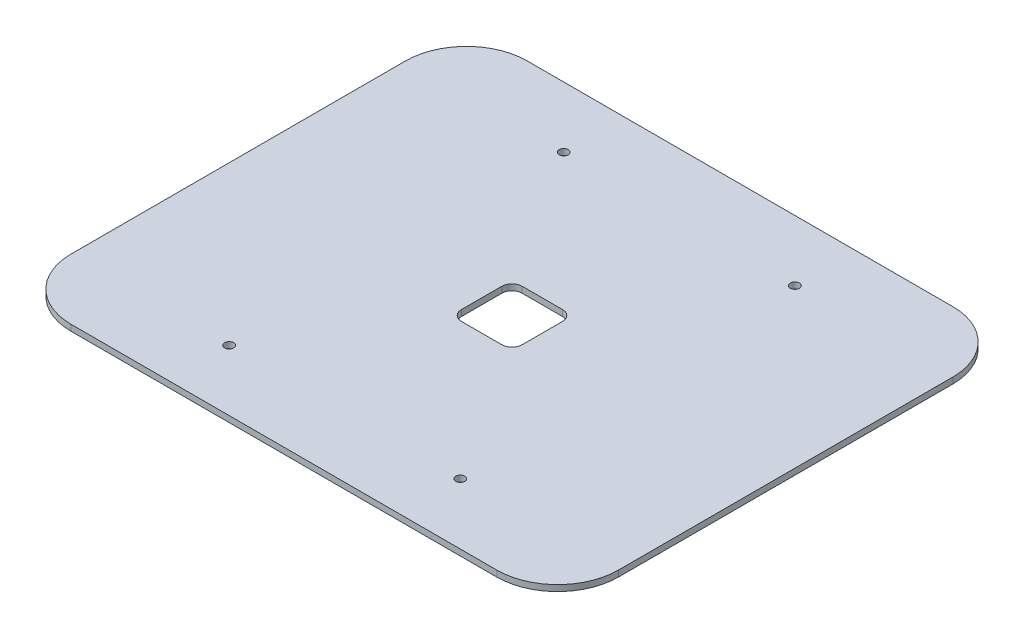
ISO-10303-21;
HEADER;
FILE_DESCRIPTION(('STEP AP214'),'2;1');
FILE_NAME('part.step','',(''),(''),'','','');
FILE_SCHEMA(('AUTOMOTIVE_DESIGN { 1 0 10303 214 1 1 1 1 }'));
ENDSEC;
DATA;
#1=APPLICATION_CONTEXT('core data for automotive mechanical design processes');
#2=APPLICATION_PROTOCOL_DEFINITION('international standard','automotive_design',2000,#1);
#3=PRODUCT_CONTEXT('',#1,'mechanical');
#4=PRODUCT('Part','Part','',(#3));
#5=PRODUCT_RELATED_PRODUCT_CATEGORY('part','',(#4));
#6=PRODUCT_DEFINITION_FORMATION('','',#4);
#7=PRODUCT_DEFINITION_CONTEXT('part definition',#1,'design');
#8=PRODUCT_DEFINITION('design','',#6,#7);
#9=PRODUCT_DEFINITION_SHAPE('','',#8);
#10=(LENGTH_UNIT() NAMED_UNIT(*) SI_UNIT(.MILLI.,.METRE.));
#11=(NAMED_UNIT(*) PLANE_ANGLE_UNIT() SI_UNIT($,.RADIAN.));
#12=(NAMED_UNIT(*) SI_UNIT($,.STERADIAN.) SOLID_ANGLE_UNIT());
#13=UNCERTAINTY_MEASURE_WITH_UNIT(LENGTH_MEASURE(1.E-05),#10,'distance_accuracy_value','');
#14=(GEOMETRIC_REPRESENTATION_CONTEXT(3) GLOBAL_UNCERTAINTY_ASSIGNED_CONTEXT((#13)) GLOBAL_UNIT_ASSIGNED_CONTEXT((#10,
#11,#12)) REPRESENTATION_CONTEXT('',''));
#15=CARTESIAN_POINT('',(0.,0.,0.));
#16=DIRECTION('',(0.,0.,1.));
#17=DIRECTION('',(1.,0.,0.));
#18=AXIS2_PLACEMENT_3D('',#15,#16,#17);
#19=CARTESIAN_POINT('',(99.18397760156,2.,-163.114483400198));
#20=DIRECTION('',(0.,-1.,0.));
#21=DIRECTION('',(0.,0.,-1.));
#22=AXIS2_PLACEMENT_3D('',#19,#20,#21);
#23=CYLINDRICAL_SURFACE('',#22,20.);
#24=CARTESIAN_POINT('',(99.18397760156,0.,-163.114483400198));
#25=DIRECTION('',(0.,1.,0.));
#26=DIRECTION('',(0.,0.,-1.));
#27=AXIS2_PLACEMENT_3D('',#24,#25,#26);
#28=CIRCLE('',#27,20.);
#29=CARTESIAN_POINT('',(119.18397760156,0.,-163.114483400198));
#30=VERTEX_POINT('',#29);
#31=CARTESIAN_POINT('',(99.18397760156,0.,-183.114483400198));
#32=VERTEX_POINT('',#31);
#33=EDGE_CURVE('E226',#30,#32,#28,.T.);
#34=ORIENTED_EDGE('',*,*,#33,.T.);
#35=DIRECTION('',(0.,-1.,0.));
#36=VECTOR('',#35,1.);
#37=CARTESIAN_POINT('',(99.18397760156,2.,-183.114483400198));
#38=LINE('',#37,#36);
#39=CARTESIAN_POINT('',(99.18397760156,2.,-183.114483400198));
#40=VERTEX_POINT('',#39);
#41=EDGE_CURVE('E262',#40,#32,#38,.T.);
#42=ORIENTED_EDGE('',*,*,#41,.F.);
#43=CARTESIAN_POINT('',(99.18397760156,2.,-163.114483400198));
#44=DIRECTION('',(0.,1.,0.));
#45=DIRECTION('',(0.,0.,-1.));
#46=AXIS2_PLACEMENT_3D('',#43,#44,#45);
#47=CIRCLE('',#46,20.);
#48=CARTESIAN_POINT('',(119.18397760156,2.,-163.114483400198));
#49=VERTEX_POINT('',#48);
#50=EDGE_CURVE('E207',#49,#40,#47,.T.);
#51=ORIENTED_EDGE('',*,*,#50,.F.);
#52=DIRECTION('',(0.,-1.,0.));
#53=VECTOR('',#52,1.);
#54=CARTESIAN_POINT('',(119.18397760156,2.,-163.114483400198));
#55=LINE('',#54,#53);
#56=EDGE_CURVE('E225',#49,#30,#55,.T.);
#57=ORIENTED_EDGE('',*,*,#56,.T.);
#58=EDGE_LOOP('',(#34,#42,#51,#57));
#59=FACE_BOUND('',#58,.T.);
#60=ADVANCED_FACE('F32',(#59),#23,.T.);
#61=CARTESIAN_POINT('',(-40.81602239844,2.,-183.114483400198));
#62=DIRECTION('',(0.,0.,1.));
#63=DIRECTION('',(1.,0.,0.));
#64=AXIS2_PLACEMENT_3D('',#61,#62,#63);
#65=PLANE('',#64);
#66=DIRECTION('',(-1.,0.,0.));
#67=VECTOR('',#66,1.);
#68=CARTESIAN_POINT('',(-40.81602239844,0.,-183.114483400198));
#69=LINE('',#68,#67);
#70=CARTESIAN_POINT('',(-40.81602239844,0.,-183.114483400198));
#71=VERTEX_POINT('',#70);
#72=EDGE_CURVE('E229',#32,#71,#69,.T.);
#73=ORIENTED_EDGE('',*,*,#72,.T.);
#74=DIRECTION('',(0.,-1.,0.));
#75=VECTOR('',#74,1.);
#76=CARTESIAN_POINT('',(-40.81602239844,2.,-183.114483400198));
#77=LINE('',#76,#75);
#78=CARTESIAN_POINT('',(-40.81602239844,2.,-183.114483400198));
#79=VERTEX_POINT('',#78);
#80=EDGE_CURVE('E259',#79,#71,#77,.T.);
#81=ORIENTED_EDGE('',*,*,#80,.F.);
#82=DIRECTION('',(-1.,0.,0.));
#83=VECTOR('',#82,1.);
#84=CARTESIAN_POINT('',(-40.81602239844,2.,-183.114483400198));
#85=LINE('',#84,#83);
#86=EDGE_CURVE('E210',#40,#79,#85,.T.);
#87=ORIENTED_EDGE('',*,*,#86,.F.);
#88=ORIENTED_EDGE('',*,*,#41,.T.);
#89=EDGE_LOOP('',(#73,#81,#87,#88));
#90=FACE_BOUND('',#89,.T.);
#91=ADVANCED_FACE('F325',(#90),#65,.F.);
#92=CARTESIAN_POINT('',(-40.81602239844,2.,-163.114483400198));
#93=DIRECTION('',(0.,-1.,0.));
#94=DIRECTION('',(0.,0.,-1.));
#95=AXIS2_PLACEMENT_3D('',#92,#93,#94);
#96=CYLINDRICAL_SURFACE('',#95,20.);
#97=CARTESIAN_POINT('',(-40.81602239844,0.,-163.114483400198));
#98=DIRECTION('',(0.,1.,0.));
#99=DIRECTION('',(0.,0.,1.));
#100=AXIS2_PLACEMENT_3D('',#97,#98,#99);
#101=CIRCLE('',#100,20.);
#102=CARTESIAN_POINT('',(-60.81602239844,0.,-163.114483400198));
#103=VERTEX_POINT('',#102);
#104=EDGE_CURVE('E231',#71,#103,#101,.T.);
#105=ORIENTED_EDGE('',*,*,#104,.T.);
#106=DIRECTION('',(0.,-1.,0.));
#107=VECTOR('',#106,1.);
#108=CARTESIAN_POINT('',(-60.81602239844,2.,-163.114483400198));
#109=LINE('',#108,#107);
#110=CARTESIAN_POINT('',(-60.81602239844,2.,-163.114483400198));
#111=VERTEX_POINT('',#110);
#112=EDGE_CURVE('E256',#111,#103,#109,.T.);
#113=ORIENTED_EDGE('',*,*,#112,.F.);
#114=CARTESIAN_POINT('',(-40.81602239844,2.,-163.114483400198));
#115=DIRECTION('',(0.,1.,0.));
#116=DIRECTION('',(0.,0.,1.));
#117=AXIS2_PLACEMENT_3D('',#114,#115,#116);
#118=CIRCLE('',#117,20.);
#119=EDGE_CURVE('E213',#79,#111,#118,.T.);
#120=ORIENTED_EDGE('',*,*,#119,.F.);
#121=ORIENTED_EDGE('',*,*,#80,.T.);
#122=EDGE_LOOP('',(#105,#113,#120,#121));
#123=FACE_BOUND('',#122,.T.);
#124=ADVANCED_FACE('F330',(#123),#96,.T.);
#125=CARTESIAN_POINT('',(-60.81602239844,2.,-163.114483400198));
#126=DIRECTION('',(1.,0.,0.));
#127=DIRECTION('',(0.,0.,-1.));
#128=AXIS2_PLACEMENT_3D('',#125,#126,#127);
#129=PLANE('',#128);
#130=DIRECTION('',(0.,0.,1.));
#131=VECTOR('',#130,1.);
#132=CARTESIAN_POINT('',(-60.81602239844,0.,-163.114483400198));
#133=LINE('',#132,#131);
#134=CARTESIAN_POINT('',(-60.81602239844,0.,-53.1144834001978));
#135=VERTEX_POINT('',#134);
#136=EDGE_CURVE('E233',#103,#135,#133,.T.);
#137=ORIENTED_EDGE('',*,*,#136,.T.);
#138=DIRECTION('',(0.,-1.,0.));
#139=VECTOR('',#138,1.);
#140=CARTESIAN_POINT('',(-60.81602239844,2.,-53.1144834001978));
#141=LINE('',#140,#139);
#142=CARTESIAN_POINT('',(-60.81602239844,2.,-53.1144834001978));
#143=VERTEX_POINT('',#142);
#144=EDGE_CURVE('E253',#143,#135,#141,.T.);
#145=ORIENTED_EDGE('',*,*,#144,.F.);
#146=DIRECTION('',(0.,0.,1.));
#147=VECTOR('',#146,1.);
#148=CARTESIAN_POINT('',(-60.81602239844,2.,-163.114483400198));
#149=LINE('',#148,#147);
#150=EDGE_CURVE('E215',#111,#143,#149,.T.);
#151=ORIENTED_EDGE('',*,*,#150,.F.);
#152=ORIENTED_EDGE('',*,*,#112,.T.);
#153=EDGE_LOOP('',(#137,#145,#151,#152));
#154=FACE_BOUND('',#153,.T.);
#155=ADVANCED_FACE('F364',(#154),#129,.F.);
#156=CARTESIAN_POINT('',(-40.81602239844,2.,-53.1144834001977));
#157=DIRECTION('',(0.,-1.,0.));
#158=DIRECTION('',(0.,0.,-1.));
#159=AXIS2_PLACEMENT_3D('',#156,#157,#158);
#160=CYLINDRICAL_SURFACE('',#159,20.);
#161=CARTESIAN_POINT('',(-40.81602239844,0.,-53.1144834001977));
#162=DIRECTION('',(0.,1.,0.));
#163=DIRECTION('',(0.,0.,1.));
#164=AXIS2_PLACEMENT_3D('',#161,#162,#163);
#165=CIRCLE('',#164,20.);
#166=CARTESIAN_POINT('',(-40.81602239844,0.,-33.1144834001977));
#167=VERTEX_POINT('',#166);
#168=EDGE_CURVE('E235',#135,#167,#165,.T.);
#169=ORIENTED_EDGE('',*,*,#168,.T.);
#170=DIRECTION('',(0.,-1.,0.));
#171=VECTOR('',#170,1.);
#172=CARTESIAN_POINT('',(-40.81602239844,2.,-33.1144834001977));
#173=LINE('',#172,#171);
#174=CARTESIAN_POINT('',(-40.81602239844,2.,-33.1144834001977));
#175=VERTEX_POINT('',#174);
#176=EDGE_CURVE('E250',#175,#167,#173,.T.);
#177=ORIENTED_EDGE('',*,*,#176,.F.);
#178=CARTESIAN_POINT('',(-40.81602239844,2.,-53.1144834001977));
#179=DIRECTION('',(0.,1.,0.));
#180=DIRECTION('',(0.,0.,1.));
#181=AXIS2_PLACEMENT_3D('',#178,#179,#180);
#182=CIRCLE('',#181,20.);
#183=EDGE_CURVE('E217',#143,#175,#182,.T.);
#184=ORIENTED_EDGE('',*,*,#183,.F.);
#185=ORIENTED_EDGE('',*,*,#144,.T.);
#186=EDGE_LOOP('',(#169,#177,#184,#185));
#187=FACE_BOUND('',#186,.T.);
#188=ADVANCED_FACE('F360',(#187),#160,.T.);
#189=CARTESIAN_POINT('',(-40.8160223984398,2.,-33.1144834001977));
#190=DIRECTION('',(0.,0.,-1.));
#191=DIRECTION('',(-1.,0.,0.));
#192=AXIS2_PLACEMENT_3D('',#189,#190,#191);
#193=PLANE('',#192);
#194=DIRECTION('',(1.,0.,0.));
#195=VECTOR('',#194,1.);
#196=CARTESIAN_POINT('',(-40.8160223984398,0.,-33.1144834001977));
#197=LINE('',#196,#195);
#198=CARTESIAN_POINT('',(99.18397760156,0.,-33.1144834001977));
#199=VERTEX_POINT('',#198);
#200=EDGE_CURVE('E237',#167,#199,#197,.T.);
#201=ORIENTED_EDGE('',*,*,#200,.T.);
#202=DIRECTION('',(0.,-1.,0.));
#203=VECTOR('',#202,1.);
#204=CARTESIAN_POINT('',(99.18397760156,2.,-33.1144834001977));
#205=LINE('',#204,#203);
#206=CARTESIAN_POINT('',(99.18397760156,2.,-33.1144834001977));
#207=VERTEX_POINT('',#206);
#208=EDGE_CURVE('E247',#207,#199,#205,.T.);
#209=ORIENTED_EDGE('',*,*,#208,.F.);
#210=DIRECTION('',(1.,0.,0.));
#211=VECTOR('',#210,1.);
#212=CARTESIAN_POINT('',(-40.8160223984398,2.,-33.1144834001977));
#213=LINE('',#212,#211);
#214=EDGE_CURVE('E219',#175,#207,#213,.T.);
#215=ORIENTED_EDGE('',*,*,#214,.F.);
#216=ORIENTED_EDGE('',*,*,#176,.T.);
#217=EDGE_LOOP('',(#201,#209,#215,#216));
#218=FACE_BOUND('',#217,.T.);
#219=ADVANCED_FACE('F355',(#218),#193,.F.);
#220=CARTESIAN_POINT('',(99.18397760156,2.,-53.1144834001977));
#221=DIRECTION('',(0.,-1.,0.));
#222=DIRECTION('',(0.,0.,-1.));
#223=AXIS2_PLACEMENT_3D('',#220,#221,#222);
#224=CYLINDRICAL_SURFACE('',#223,20.);
#225=CARTESIAN_POINT('',(99.18397760156,0.,-53.1144834001977));
#226=DIRECTION('',(0.,1.,0.));
#227=DIRECTION('',(0.,0.,1.));
#228=AXIS2_PLACEMENT_3D('',#225,#226,#227);
#229=CIRCLE('',#228,20.);
#230=CARTESIAN_POINT('',(119.18397760156,0.,-53.1144834001977));
#231=VERTEX_POINT('',#230);
#232=EDGE_CURVE('E239',#199,#231,#229,.T.);
#233=ORIENTED_EDGE('',*,*,#232,.T.);
#234=DIRECTION('',(0.,-1.,0.));
#235=VECTOR('',#234,1.);
#236=CARTESIAN_POINT('',(119.18397760156,2.,-53.1144834001977));
#237=LINE('',#236,#235);
#238=CARTESIAN_POINT('',(119.18397760156,2.,-53.1144834001977));
#239=VERTEX_POINT('',#238);
#240=EDGE_CURVE('E244',#239,#231,#237,.T.);
#241=ORIENTED_EDGE('',*,*,#240,.F.);
#242=CARTESIAN_POINT('',(99.18397760156,2.,-53.1144834001977));
#243=DIRECTION('',(0.,1.,0.));
#244=DIRECTION('',(0.,0.,1.));
#245=AXIS2_PLACEMENT_3D('',#242,#243,#244);
#246=CIRCLE('',#245,20.);
#247=EDGE_CURVE('E221',#207,#239,#246,.T.);
#248=ORIENTED_EDGE('',*,*,#247,.F.);
#249=ORIENTED_EDGE('',*,*,#208,.T.);
#250=EDGE_LOOP('',(#233,#241,#248,#249));
#251=FACE_BOUND('',#250,.T.);
#252=ADVANCED_FACE('F350',(#251),#224,.T.);
#253=CARTESIAN_POINT('',(119.18397760156,2.,-163.114483400198));
#254=DIRECTION('',(-1.,0.,0.));
#255=DIRECTION('',(0.,0.,1.));
#256=AXIS2_PLACEMENT_3D('',#253,#254,#255);
#257=PLANE('',#256);
#258=DIRECTION('',(0.,0.,-1.));
#259=VECTOR('',#258,1.);
#260=CARTESIAN_POINT('',(119.18397760156,0.,-163.114483400198));
#261=LINE('',#260,#259);
#262=EDGE_CURVE('E211',#231,#30,#261,.T.);
#263=ORIENTED_EDGE('',*,*,#262,.T.);
#264=ORIENTED_EDGE('',*,*,#56,.F.);
#265=DIRECTION('',(0.,0.,-1.));
#266=VECTOR('',#265,1.);
#267=CARTESIAN_POINT('',(119.18397760156,2.,-163.114483400198));
#268=LINE('',#267,#266);
#269=EDGE_CURVE('E223',#239,#49,#268,.T.);
#270=ORIENTED_EDGE('',*,*,#269,.F.);
#271=ORIENTED_EDGE('',*,*,#240,.T.);
#272=EDGE_LOOP('',(#263,#264,#270,#271));
#273=FACE_BOUND('',#272,.T.);
#274=ADVANCED_FACE('F348',(#273),#257,.F.);
#275=CARTESIAN_POINT('',(99.18397760156,2.,-163.114483400198));
#276=DIRECTION('',(0.,-1.,0.));
#277=DIRECTION('',(0.,0.,-1.));
#278=AXIS2_PLACEMENT_3D('',#275,#276,#277);
#279=PLANE('',#278);
#280=DIRECTION('',(-1.,0.,0.));
#281=VECTOR('',#280,1.);
#282=CARTESIAN_POINT('',(22.5532138576479,2.,-118.114483400198));
#283=LINE('',#282,#281);
#284=CARTESIAN_POINT('',(35.8147413454721,2.,-118.114483400198));
#285=VERTEX_POINT('',#284);
#286=CARTESIAN_POINT('',(22.5532138576479,2.,-118.114483400198));
#287=VERTEX_POINT('',#286);
#288=EDGE_CURVE('E155',#285,#287,#283,.T.);
#289=ORIENTED_EDGE('',*,*,#288,.F.);
#290=CARTESIAN_POINT('',(35.8147413454722,2.,-114.74524714411));
#291=DIRECTION('',(0.,1.,0.));
#292=DIRECTION('',(0.,0.,1.));
#293=AXIS2_PLACEMENT_3D('',#290,#291,#292);
#294=CIRCLE('',#293,3.36923625608787);
#295=CARTESIAN_POINT('',(39.18397760156,2.,-114.74524714411));
#296=VERTEX_POINT('',#295);
#297=EDGE_CURVE('E46',#296,#285,#294,.T.);
#298=ORIENTED_EDGE('',*,*,#297,.F.);
#299=DIRECTION('',(0.,0.,-1.));
#300=VECTOR('',#299,1.);
#301=CARTESIAN_POINT('',(39.18397760156,2.,-114.74524714411));
#302=LINE('',#301,#300);
#303=CARTESIAN_POINT('',(39.18397760156,2.,-101.483719656286));
#304=VERTEX_POINT('',#303);
#305=EDGE_CURVE('E177',#304,#296,#302,.T.);
#306=ORIENTED_EDGE('',*,*,#305,.F.);
#307=CARTESIAN_POINT('',(35.8147413454722,2.,-101.483719656286));
#308=DIRECTION('',(0.,1.,0.));
#309=DIRECTION('',(0.,0.,1.));
#310=AXIS2_PLACEMENT_3D('',#307,#308,#309);
#311=CIRCLE('',#310,3.36923625608787);
#312=CARTESIAN_POINT('',(35.8147413454721,2.,-98.1144834001977));
#313=VERTEX_POINT('',#312);
#314=EDGE_CURVE('E174',#313,#304,#311,.T.);
#315=ORIENTED_EDGE('',*,*,#314,.F.);
#316=DIRECTION('',(1.,0.,0.));
#317=VECTOR('',#316,1.);
#318=CARTESIAN_POINT('',(22.5532138576479,2.,-98.1144834001977));
#319=LINE('',#318,#317);
#320=CARTESIAN_POINT('',(22.5532138576479,2.,-98.1144834001977));
#321=VERTEX_POINT('',#320);
#322=EDGE_CURVE('E171',#321,#313,#319,.T.);
#323=ORIENTED_EDGE('',*,*,#322,.F.);
#324=CARTESIAN_POINT('',(22.5532138576479,2.,-101.483719656286));
#325=DIRECTION('',(0.,1.,0.));
#326=DIRECTION('',(0.,0.,-1.));
#327=AXIS2_PLACEMENT_3D('',#324,#325,#326);
#328=CIRCLE('',#327,3.36923625608787);
#329=CARTESIAN_POINT('',(19.18397760156,2.,-101.483719656286));
#330=VERTEX_POINT('',#329);
#331=EDGE_CURVE('E165',#330,#321,#328,.T.);
#332=ORIENTED_EDGE('',*,*,#331,.F.);
#333=DIRECTION('',(0.,0.,1.));
#334=VECTOR('',#333,1.);
#335=CARTESIAN_POINT('',(19.18397760156,2.,-114.74524714411));
#336=LINE('',#335,#334);
#337=CARTESIAN_POINT('',(19.18397760156,2.,-114.74524714411));
#338=VERTEX_POINT('',#337);
#339=EDGE_CURVE('E163',#338,#330,#336,.T.);
#340=ORIENTED_EDGE('',*,*,#339,.F.);
#341=CARTESIAN_POINT('',(22.5532138576479,2.,-114.74524714411));
#342=DIRECTION('',(0.,1.,0.));
#343=DIRECTION('',(0.,0.,1.));
#344=AXIS2_PLACEMENT_3D('',#341,#342,#343);
#345=CIRCLE('',#344,3.36923625608787);
#346=EDGE_CURVE('E146',#287,#338,#345,.T.);
#347=ORIENTED_EDGE('',*,*,#346,.F.);
#348=EDGE_LOOP('',(#289,#298,#306,#315,#323,#332,#340,#347));
#349=FACE_BOUND('',#348,.T.);
#350=CARTESIAN_POINT('',(67.18397760156,2.,-163.114483400198));
#351=DIRECTION('',(0.,1.,0.));
#352=DIRECTION('',(0.,0.,1.));
#353=AXIS2_PLACEMENT_3D('',#350,#351,#352);
#354=CIRCLE('',#353,1.5);
#355=CARTESIAN_POINT('',(67.18397760156,2.,-161.614483400198));
#356=VERTEX_POINT('',#355);
#357=EDGE_CURVE('E193',#356,#356,#354,.T.);
#358=ORIENTED_EDGE('',*,*,#357,.F.);
#359=EDGE_LOOP('',(#358));
#360=FACE_BOUND('',#359,.T.);
#361=CARTESIAN_POINT('',(67.18397760156,2.,-53.1144834001977));
#362=DIRECTION('',(0.,1.,0.));
#363=DIRECTION('',(0.,0.,1.));
#364=AXIS2_PLACEMENT_3D('',#361,#362,#363);
#365=CIRCLE('',#364,1.5);
#366=CARTESIAN_POINT('',(67.18397760156,2.,-51.6144834001977));
#367=VERTEX_POINT('',#366);
#368=EDGE_CURVE('E197',#367,#367,#365,.T.);
#369=ORIENTED_EDGE('',*,*,#368,.F.);
#370=EDGE_LOOP('',(#369));
#371=FACE_BOUND('',#370,.T.);
#372=CARTESIAN_POINT('',(-8.81602239843997,2.,-53.1144834001977));
#373=DIRECTION('',(0.,1.,0.));
#374=DIRECTION('',(0.,0.,1.));
#375=AXIS2_PLACEMENT_3D('',#372,#373,#374);
#376=CIRCLE('',#375,1.5);
#377=CARTESIAN_POINT('',(-8.81602239843997,2.,-51.6144834001977));
#378=VERTEX_POINT('',#377);
#379=EDGE_CURVE('E182',#378,#378,#376,.T.);
#380=ORIENTED_EDGE('',*,*,#379,.F.);
#381=EDGE_LOOP('',(#380));
#382=FACE_BOUND('',#381,.T.);
#383=CARTESIAN_POINT('',(-8.81602239843999,2.,-163.114483400198));
#384=DIRECTION('',(0.,1.,0.));
#385=DIRECTION('',(0.,0.,1.));
#386=AXIS2_PLACEMENT_3D('',#383,#384,#385);
#387=CIRCLE('',#386,1.5);
#388=CARTESIAN_POINT('',(-8.81602239843999,2.,-161.614483400198));
#389=VERTEX_POINT('',#388);
#390=EDGE_CURVE('E202',#389,#389,#387,.T.);
#391=ORIENTED_EDGE('',*,*,#390,.F.);
#392=EDGE_LOOP('',(#391));
#393=FACE_BOUND('',#392,.T.);
#394=ORIENTED_EDGE('',*,*,#50,.T.);
#395=ORIENTED_EDGE('',*,*,#86,.T.);
#396=ORIENTED_EDGE('',*,*,#119,.T.);
#397=ORIENTED_EDGE('',*,*,#150,.T.);
#398=ORIENTED_EDGE('',*,*,#183,.T.);
#399=ORIENTED_EDGE('',*,*,#214,.T.);
#400=ORIENTED_EDGE('',*,*,#247,.T.);
#401=ORIENTED_EDGE('',*,*,#269,.T.);
#402=EDGE_LOOP('',(#394,#395,#396,#397,#398,#399,#400,#401));
#403=FACE_BOUND('',#402,.T.);
#404=ADVANCED_FACE('F159',(#349,#360,#371,#382,#393,#403),#279,.F.);
#405=CARTESIAN_POINT('',(99.18397760156,0.,-163.114483400198));
#406=DIRECTION('',(0.,-1.,0.));
#407=DIRECTION('',(0.,0.,-1.));
#408=AXIS2_PLACEMENT_3D('',#405,#406,#407);
#409=PLANE('',#408);
#410=CARTESIAN_POINT('',(35.8147413454722,0.,-114.74524714411));
#411=DIRECTION('',(0.,-1.,0.));
#412=DIRECTION('',(0.,0.,-1.));
#413=AXIS2_PLACEMENT_3D('',#410,#411,#412);
#414=CIRCLE('',#413,3.36923625608787);
#415=CARTESIAN_POINT('',(35.8147413454721,0.,-118.114483400198));
#416=VERTEX_POINT('',#415);
#417=CARTESIAN_POINT('',(39.18397760156,0.,-114.74524714411));
#418=VERTEX_POINT('',#417);
#419=EDGE_CURVE('E11',#416,#418,#414,.T.);
#420=ORIENTED_EDGE('',*,*,#419,.F.);
#421=DIRECTION('',(1.,0.,0.));
#422=VECTOR('',#421,1.);
#423=CARTESIAN_POINT('',(99.18397760156,0.,-118.114483400198));
#424=LINE('',#423,#422);
#425=CARTESIAN_POINT('',(22.5532138576479,0.,-118.114483400198));
#426=VERTEX_POINT('',#425);
#427=EDGE_CURVE('E265',#426,#416,#424,.T.);
#428=ORIENTED_EDGE('',*,*,#427,.F.);
#429=CARTESIAN_POINT('',(22.5532138576479,0.,-114.74524714411));
#430=DIRECTION('',(0.,-1.,0.));
#431=DIRECTION('',(0.,0.,-1.));
#432=AXIS2_PLACEMENT_3D('',#429,#430,#431);
#433=CIRCLE('',#432,3.36923625608787);
#434=CARTESIAN_POINT('',(19.18397760156,0.,-114.74524714411));
#435=VERTEX_POINT('',#434);
#436=EDGE_CURVE('E149',#435,#426,#433,.T.);
#437=ORIENTED_EDGE('',*,*,#436,.F.);
#438=DIRECTION('',(0.,0.,-1.));
#439=VECTOR('',#438,1.);
#440=CARTESIAN_POINT('',(19.18397760156,0.,-163.114483400198));
#441=LINE('',#440,#439);
#442=CARTESIAN_POINT('',(19.18397760156,0.,-101.483719656286));
#443=VERTEX_POINT('',#442);
#444=EDGE_CURVE('E277',#443,#435,#441,.T.);
#445=ORIENTED_EDGE('',*,*,#444,.F.);
#446=CARTESIAN_POINT('',(22.5532138576479,0.,-101.483719656286));
#447=DIRECTION('',(0.,-1.,0.));
#448=DIRECTION('',(0.,0.,-1.));
#449=AXIS2_PLACEMENT_3D('',#446,#447,#448);
#450=CIRCLE('',#449,3.36923625608787);
#451=CARTESIAN_POINT('',(22.5532138576479,0.,-98.1144834001977));
#452=VERTEX_POINT('',#451);
#453=EDGE_CURVE('E279',#452,#443,#450,.T.);
#454=ORIENTED_EDGE('',*,*,#453,.F.);
#455=DIRECTION('',(-1.,0.,0.));
#456=VECTOR('',#455,1.);
#457=CARTESIAN_POINT('',(99.18397760156,0.,-98.1144834001977));
#458=LINE('',#457,#456);
#459=CARTESIAN_POINT('',(35.8147413454721,0.,-98.1144834001977));
#460=VERTEX_POINT('',#459);
#461=EDGE_CURVE('E281',#460,#452,#458,.T.);
#462=ORIENTED_EDGE('',*,*,#461,.F.);
#463=CARTESIAN_POINT('',(35.8147413454722,0.,-101.483719656286));
#464=DIRECTION('',(0.,-1.,0.));
#465=DIRECTION('',(0.,0.,-1.));
#466=AXIS2_PLACEMENT_3D('',#463,#464,#465);
#467=CIRCLE('',#466,3.36923625608787);
#468=CARTESIAN_POINT('',(39.18397760156,0.,-101.483719656286));
#469=VERTEX_POINT('',#468);
#470=EDGE_CURVE('E283',#469,#460,#467,.T.);
#471=ORIENTED_EDGE('',*,*,#470,.F.);
#472=DIRECTION('',(0.,0.,1.));
#473=VECTOR('',#472,1.);
#474=CARTESIAN_POINT('',(39.18397760156,0.,-163.114483400198));
#475=LINE('',#474,#473);
#476=EDGE_CURVE('E39',#418,#469,#475,.T.);
#477=ORIENTED_EDGE('',*,*,#476,.F.);
#478=EDGE_LOOP('',(#420,#428,#437,#445,#454,#462,#471,#477));
#479=FACE_BOUND('',#478,.T.);
#480=CARTESIAN_POINT('',(67.18397760156,0.,-163.114483400198));
#481=DIRECTION('',(0.,-1.,0.));
#482=DIRECTION('',(0.,0.,-1.));
#483=AXIS2_PLACEMENT_3D('',#480,#481,#482);
#484=CIRCLE('',#483,1.5);
#485=CARTESIAN_POINT('',(67.18397760156,0.,-164.614483400198));
#486=VERTEX_POINT('',#485);
#487=EDGE_CURVE('E206',#486,#486,#484,.T.);
#488=ORIENTED_EDGE('',*,*,#487,.F.);
#489=EDGE_LOOP('',(#488));
#490=FACE_BOUND('',#489,.T.);
#491=CARTESIAN_POINT('',(67.18397760156,0.,-53.1144834001977));
#492=DIRECTION('',(0.,-1.,0.));
#493=DIRECTION('',(0.,0.,-1.));
#494=AXIS2_PLACEMENT_3D('',#491,#492,#493);
#495=CIRCLE('',#494,1.5);
#496=CARTESIAN_POINT('',(67.18397760156,0.,-54.6144834001977));
#497=VERTEX_POINT('',#496);
#498=EDGE_CURVE('E270',#497,#497,#495,.T.);
#499=ORIENTED_EDGE('',*,*,#498,.F.);
#500=EDGE_LOOP('',(#499));
#501=FACE_BOUND('',#500,.T.);
#502=CARTESIAN_POINT('',(-8.81602239843997,0.,-53.1144834001977));
#503=DIRECTION('',(0.,-1.,0.));
#504=DIRECTION('',(0.,0.,-1.));
#505=AXIS2_PLACEMENT_3D('',#502,#503,#504);
#506=CIRCLE('',#505,1.5);
#507=CARTESIAN_POINT('',(-8.81602239843997,0.,-54.6144834001977));
#508=VERTEX_POINT('',#507);
#509=EDGE_CURVE('E196',#508,#508,#506,.T.);
#510=ORIENTED_EDGE('',*,*,#509,.F.);
#511=EDGE_LOOP('',(#510));
#512=FACE_BOUND('',#511,.T.);
#513=CARTESIAN_POINT('',(-8.81602239843999,0.,-163.114483400198));
#514=DIRECTION('',(0.,-1.,0.));
#515=DIRECTION('',(0.,0.,-1.));
#516=AXIS2_PLACEMENT_3D('',#513,#514,#515);
#517=CIRCLE('',#516,1.5);
#518=CARTESIAN_POINT('',(-8.81602239843999,0.,-164.614483400198));
#519=VERTEX_POINT('',#518);
#520=EDGE_CURVE('E205',#519,#519,#517,.T.);
#521=ORIENTED_EDGE('',*,*,#520,.F.);
#522=EDGE_LOOP('',(#521));
#523=FACE_BOUND('',#522,.T.);
#524=ORIENTED_EDGE('',*,*,#33,.F.);
#525=ORIENTED_EDGE('',*,*,#262,.F.);
#526=ORIENTED_EDGE('',*,*,#232,.F.);
#527=ORIENTED_EDGE('',*,*,#200,.F.);
#528=ORIENTED_EDGE('',*,*,#168,.F.);
#529=ORIENTED_EDGE('',*,*,#136,.F.);
#530=ORIENTED_EDGE('',*,*,#104,.F.);
#531=ORIENTED_EDGE('',*,*,#72,.F.);
#532=EDGE_LOOP('',(#524,#525,#526,#527,#528,#529,#530,#531));
#533=FACE_BOUND('',#532,.T.);
#534=ADVANCED_FACE('F298',(#479,#490,#501,#512,#523,#533),#409,.T.);
#535=CARTESIAN_POINT('',(-8.81602239843999,-8.,-163.114483400198));
#536=DIRECTION('',(0.,1.,0.));
#537=DIRECTION('',(0.,0.,1.));
#538=AXIS2_PLACEMENT_3D('',#535,#536,#537);
#539=CYLINDRICAL_SURFACE('',#538,1.5);
#540=ORIENTED_EDGE('',*,*,#520,.T.);
#541=EDGE_LOOP('',(#540));
#542=FACE_BOUND('',#541,.T.);
#543=ORIENTED_EDGE('',*,*,#390,.T.);
#544=EDGE_LOOP('',(#543));
#545=FACE_BOUND('',#544,.T.);
#546=ADVANCED_FACE('F384',(#542,#545),#539,.F.);
#547=CARTESIAN_POINT('',(-8.81602239843997,-8.,-53.1144834001977));
#548=DIRECTION('',(0.,1.,0.));
#549=DIRECTION('',(0.,0.,1.));
#550=AXIS2_PLACEMENT_3D('',#547,#548,#549);
#551=CYLINDRICAL_SURFACE('',#550,1.5);
#552=ORIENTED_EDGE('',*,*,#509,.T.);
#553=EDGE_LOOP('',(#552));
#554=FACE_BOUND('',#553,.T.);
#555=ORIENTED_EDGE('',*,*,#379,.T.);
#556=EDGE_LOOP('',(#555));
#557=FACE_BOUND('',#556,.T.);
#558=ADVANCED_FACE('F389',(#554,#557),#551,.F.);
#559=CARTESIAN_POINT('',(67.18397760156,-8.,-53.1144834001977));
#560=DIRECTION('',(0.,1.,0.));
#561=DIRECTION('',(0.,0.,1.));
#562=AXIS2_PLACEMENT_3D('',#559,#560,#561);
#563=CYLINDRICAL_SURFACE('',#562,1.5);
#564=ORIENTED_EDGE('',*,*,#498,.T.);
#565=EDGE_LOOP('',(#564));
#566=FACE_BOUND('',#565,.T.);
#567=ORIENTED_EDGE('',*,*,#368,.T.);
#568=EDGE_LOOP('',(#567));
#569=FACE_BOUND('',#568,.T.);
#570=ADVANCED_FACE('F320',(#566,#569),#563,.F.);
#571=CARTESIAN_POINT('',(67.18397760156,-8.,-163.114483400198));
#572=DIRECTION('',(0.,1.,0.));
#573=DIRECTION('',(0.,0.,1.));
#574=AXIS2_PLACEMENT_3D('',#571,#572,#573);
#575=CYLINDRICAL_SURFACE('',#574,1.5);
#576=ORIENTED_EDGE('',*,*,#487,.T.);
#577=EDGE_LOOP('',(#576));
#578=FACE_BOUND('',#577,.T.);
#579=ORIENTED_EDGE('',*,*,#357,.T.);
#580=EDGE_LOOP('',(#579));
#581=FACE_BOUND('',#580,.T.);
#582=ADVANCED_FACE('F313',(#578,#581),#575,.F.);
#583=CARTESIAN_POINT('',(35.8147413454722,-8.,-114.74524714411));
#584=DIRECTION('',(0.,1.,0.));
#585=DIRECTION('',(0.,0.,1.));
#586=AXIS2_PLACEMENT_3D('',#583,#584,#585);
#587=CYLINDRICAL_SURFACE('',#586,3.36923625608787);
#588=ORIENTED_EDGE('',*,*,#419,.T.);
#589=DIRECTION('',(0.,1.,0.));
#590=VECTOR('',#589,1.);
#591=CARTESIAN_POINT('',(39.18397760156,-8.,-114.74524714411));
#592=LINE('',#591,#590);
#593=EDGE_CURVE('E180',#418,#296,#592,.T.);
#594=ORIENTED_EDGE('',*,*,#593,.T.);
#595=ORIENTED_EDGE('',*,*,#297,.T.);
#596=DIRECTION('',(0.,1.,0.));
#597=VECTOR('',#596,1.);
#598=CARTESIAN_POINT('',(35.8147413454721,-8.,-118.114483400198));
#599=LINE('',#598,#597);
#600=EDGE_CURVE('E152',#416,#285,#599,.T.);
#601=ORIENTED_EDGE('',*,*,#600,.F.);
#602=EDGE_LOOP('',(#588,#594,#595,#601));
#603=FACE_BOUND('',#602,.T.);
#604=ADVANCED_FACE('F311',(#603),#587,.F.);
#605=CARTESIAN_POINT('',(39.18397760156,-8.,-114.74524714411));
#606=DIRECTION('',(1.,0.,0.));
#607=DIRECTION('',(0.,0.,-1.));
#608=AXIS2_PLACEMENT_3D('',#605,#606,#607);
#609=PLANE('',#608);
#610=ORIENTED_EDGE('',*,*,#476,.T.);
#611=DIRECTION('',(0.,1.,0.));
#612=VECTOR('',#611,1.);
#613=CARTESIAN_POINT('',(39.18397760156,-8.,-101.483719656286));
#614=LINE('',#613,#612);
#615=EDGE_CURVE('E183',#469,#304,#614,.T.);
#616=ORIENTED_EDGE('',*,*,#615,.T.);
#617=ORIENTED_EDGE('',*,*,#305,.T.);
#618=ORIENTED_EDGE('',*,*,#593,.F.);
#619=EDGE_LOOP('',(#610,#616,#617,#618));
#620=FACE_BOUND('',#619,.T.);
#621=ADVANCED_FACE('F288',(#620),#609,.F.);
#622=CARTESIAN_POINT('',(35.8147413454722,-8.,-101.483719656286));
#623=DIRECTION('',(0.,1.,0.));
#624=DIRECTION('',(0.,0.,1.));
#625=AXIS2_PLACEMENT_3D('',#622,#623,#624);
#626=CYLINDRICAL_SURFACE('',#625,3.36923625608787);
#627=ORIENTED_EDGE('',*,*,#470,.T.);
#628=DIRECTION('',(0.,1.,0.));
#629=VECTOR('',#628,1.);
#630=CARTESIAN_POINT('',(35.8147413454721,-8.,-98.1144834001977));
#631=LINE('',#630,#629);
#632=EDGE_CURVE('E185',#460,#313,#631,.T.);
#633=ORIENTED_EDGE('',*,*,#632,.T.);
#634=ORIENTED_EDGE('',*,*,#314,.T.);
#635=ORIENTED_EDGE('',*,*,#615,.F.);
#636=EDGE_LOOP('',(#627,#633,#634,#635));
#637=FACE_BOUND('',#636,.T.);
#638=ADVANCED_FACE('F293',(#637),#626,.F.);
#639=CARTESIAN_POINT('',(22.5532138576479,-8.,-98.1144834001977));
#640=DIRECTION('',(0.,0.,1.));
#641=DIRECTION('',(1.,0.,0.));
#642=AXIS2_PLACEMENT_3D('',#639,#640,#641);
#643=PLANE('',#642);
#644=ORIENTED_EDGE('',*,*,#461,.T.);
#645=DIRECTION('',(0.,1.,0.));
#646=VECTOR('',#645,1.);
#647=CARTESIAN_POINT('',(22.5532138576479,-8.,-98.1144834001977));
#648=LINE('',#647,#646);
#649=EDGE_CURVE('E187',#452,#321,#648,.T.);
#650=ORIENTED_EDGE('',*,*,#649,.T.);
#651=ORIENTED_EDGE('',*,*,#322,.T.);
#652=ORIENTED_EDGE('',*,*,#632,.F.);
#653=EDGE_LOOP('',(#644,#650,#651,#652));
#654=FACE_BOUND('',#653,.T.);
#655=ADVANCED_FACE('F304',(#654),#643,.F.);
#656=CARTESIAN_POINT('',(22.5532138576479,-8.,-101.483719656286));
#657=DIRECTION('',(0.,1.,0.));
#658=DIRECTION('',(0.,0.,1.));
#659=AXIS2_PLACEMENT_3D('',#656,#657,#658);
#660=CYLINDRICAL_SURFACE('',#659,3.36923625608787);
#661=ORIENTED_EDGE('',*,*,#453,.T.);
#662=DIRECTION('',(0.,1.,0.));
#663=VECTOR('',#662,1.);
#664=CARTESIAN_POINT('',(19.18397760156,-8.,-101.483719656286));
#665=LINE('',#664,#663);
#666=EDGE_CURVE('E189',#443,#330,#665,.T.);
#667=ORIENTED_EDGE('',*,*,#666,.T.);
#668=ORIENTED_EDGE('',*,*,#331,.T.);
#669=ORIENTED_EDGE('',*,*,#649,.F.);
#670=EDGE_LOOP('',(#661,#667,#668,#669));
#671=FACE_BOUND('',#670,.T.);
#672=ADVANCED_FACE('F306',(#671),#660,.F.);
#673=CARTESIAN_POINT('',(19.18397760156,-8.,-114.74524714411));
#674=DIRECTION('',(-1.,0.,0.));
#675=DIRECTION('',(0.,0.,1.));
#676=AXIS2_PLACEMENT_3D('',#673,#674,#675);
#677=PLANE('',#676);
#678=ORIENTED_EDGE('',*,*,#444,.T.);
#679=DIRECTION('',(0.,1.,0.));
#680=VECTOR('',#679,1.);
#681=CARTESIAN_POINT('',(19.18397760156,-8.,-114.74524714411));
#682=LINE('',#681,#680);
#683=EDGE_CURVE('E151',#435,#338,#682,.T.);
#684=ORIENTED_EDGE('',*,*,#683,.T.);
#685=ORIENTED_EDGE('',*,*,#339,.T.);
#686=ORIENTED_EDGE('',*,*,#666,.F.);
#687=EDGE_LOOP('',(#678,#684,#685,#686));
#688=FACE_BOUND('',#687,.T.);
#689=ADVANCED_FACE('F310',(#688),#677,.F.);
#690=CARTESIAN_POINT('',(22.5532138576479,-8.,-114.74524714411));
#691=DIRECTION('',(0.,1.,0.));
#692=DIRECTION('',(0.,0.,1.));
#693=AXIS2_PLACEMENT_3D('',#690,#691,#692);
#694=CYLINDRICAL_SURFACE('',#693,3.36923625608787);
#695=ORIENTED_EDGE('',*,*,#436,.T.);
#696=DIRECTION('',(0.,1.,0.));
#697=VECTOR('',#696,1.);
#698=CARTESIAN_POINT('',(22.5532138576479,-8.,-118.114483400198));
#699=LINE('',#698,#697);
#700=EDGE_CURVE('E54',#426,#287,#699,.T.);
#701=ORIENTED_EDGE('',*,*,#700,.T.);
#702=ORIENTED_EDGE('',*,*,#346,.T.);
#703=ORIENTED_EDGE('',*,*,#683,.F.);
#704=EDGE_LOOP('',(#695,#701,#702,#703));
#705=FACE_BOUND('',#704,.T.);
#706=ADVANCED_FACE('F143',(#705),#694,.F.);
#707=CARTESIAN_POINT('',(22.5532138576479,-8.,-118.114483400198));
#708=DIRECTION('',(0.,0.,-1.));
#709=DIRECTION('',(-1.,0.,0.));
#710=AXIS2_PLACEMENT_3D('',#707,#708,#709);
#711=PLANE('',#710);
#712=ORIENTED_EDGE('',*,*,#427,.T.);
#713=ORIENTED_EDGE('',*,*,#600,.T.);
#714=ORIENTED_EDGE('',*,*,#288,.T.);
#715=ORIENTED_EDGE('',*,*,#700,.F.);
#716=EDGE_LOOP('',(#712,#713,#714,#715));
#717=FACE_BOUND('',#716,.T.);
#718=ADVANCED_FACE('F156',(#717),#711,.F.);
#719=CLOSED_SHELL('',(#60,#91,#124,#155,#188,#219,#252,#274,#404,#534,#546,#558,#570,#582,#604,
#621,#638,#655,#672,#689,#706,#718));
#720=MANIFOLD_SOLID_BREP('B2',#719);
#721=ADVANCED_BREP_SHAPE_REPRESENTATION('',(#18,#720),#14);
#722=SHAPE_DEFINITION_REPRESENTATION(#9,#721);
ENDSEC;
END-ISO-10303-21;
